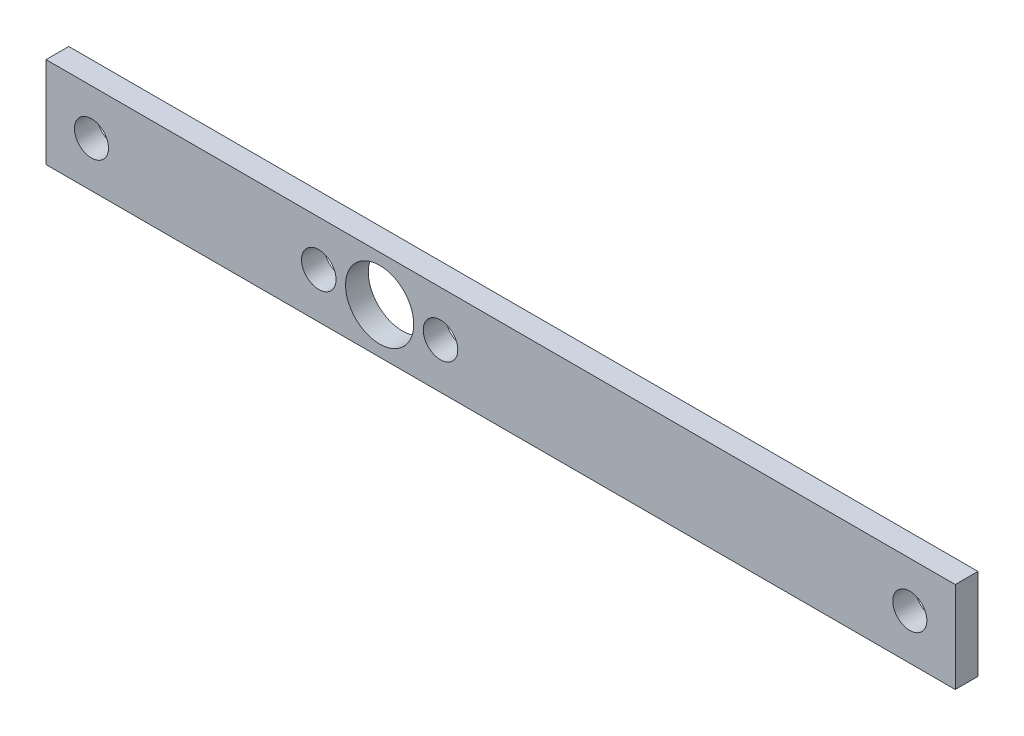
ISO-10303-21;
HEADER;
FILE_DESCRIPTION(('STEP AP214'),'2;1');
FILE_NAME('part.step','',(''),(''),'','','');
FILE_SCHEMA(('AUTOMOTIVE_DESIGN { 1 0 10303 214 1 1 1 1 }'));
ENDSEC;
DATA;
#1=APPLICATION_CONTEXT('core data for automotive mechanical design processes');
#2=APPLICATION_PROTOCOL_DEFINITION('international standard','automotive_design',2000,#1);
#3=PRODUCT_CONTEXT('',#1,'mechanical');
#4=PRODUCT('Part','Part','',(#3));
#5=PRODUCT_RELATED_PRODUCT_CATEGORY('part','',(#4));
#6=PRODUCT_DEFINITION_FORMATION('','',#4);
#7=PRODUCT_DEFINITION_CONTEXT('part definition',#1,'design');
#8=PRODUCT_DEFINITION('design','',#6,#7);
#9=PRODUCT_DEFINITION_SHAPE('','',#8);
#10=(LENGTH_UNIT() NAMED_UNIT(*) SI_UNIT(.MILLI.,.METRE.));
#11=(NAMED_UNIT(*) PLANE_ANGLE_UNIT() SI_UNIT($,.RADIAN.));
#12=(NAMED_UNIT(*) SI_UNIT($,.STERADIAN.) SOLID_ANGLE_UNIT());
#13=UNCERTAINTY_MEASURE_WITH_UNIT(LENGTH_MEASURE(1.E-05),#10,'distance_accuracy_value','');
#14=(GEOMETRIC_REPRESENTATION_CONTEXT(3) GLOBAL_UNCERTAINTY_ASSIGNED_CONTEXT((#13)) GLOBAL_UNIT_ASSIGNED_CONTEXT((#10,
#11,#12)) REPRESENTATION_CONTEXT('',''));
#15=CARTESIAN_POINT('',(0.,0.,0.));
#16=DIRECTION('',(0.,0.,1.));
#17=DIRECTION('',(1.,0.,0.));
#18=AXIS2_PLACEMENT_3D('',#15,#16,#17);
#19=CARTESIAN_POINT('',(0.,0.,3.175));
#20=DIRECTION('',(0.,0.,-1.));
#21=DIRECTION('',(-1.,0.,0.));
#22=AXIS2_PLACEMENT_3D('',#19,#20,#21);
#23=PLANE('',#22);
#24=DIRECTION('',(0.,-1.,0.));
#25=VECTOR('',#24,1.);
#26=CARTESIAN_POINT('',(0.,0.,3.175));
#27=LINE('',#26,#25);
#28=CARTESIAN_POINT('',(0.,12.7,3.175));
#29=VERTEX_POINT('',#28);
#30=CARTESIAN_POINT('',(0.,0.,3.175));
#31=VERTEX_POINT('',#30);
#32=EDGE_CURVE('E89',#29,#31,#27,.T.);
#33=ORIENTED_EDGE('',*,*,#32,.T.);
#34=DIRECTION('',(1.,0.,0.));
#35=VECTOR('',#34,1.);
#36=CARTESIAN_POINT('',(0.,0.,3.175));
#37=LINE('',#36,#35);
#38=CARTESIAN_POINT('',(127.,0.,3.175));
#39=VERTEX_POINT('',#38);
#40=EDGE_CURVE('E84',#31,#39,#37,.T.);
#41=ORIENTED_EDGE('',*,*,#40,.T.);
#42=DIRECTION('',(0.,1.,0.));
#43=VECTOR('',#42,1.);
#44=CARTESIAN_POINT('',(127.,0.,3.175));
#45=LINE('',#44,#43);
#46=CARTESIAN_POINT('',(127.,12.7,3.175));
#47=VERTEX_POINT('',#46);
#48=EDGE_CURVE('E87',#39,#47,#45,.T.);
#49=ORIENTED_EDGE('',*,*,#48,.T.);
#50=DIRECTION('',(-1.,0.,0.));
#51=VECTOR('',#50,1.);
#52=CARTESIAN_POINT('',(0.,12.7,3.175));
#53=LINE('',#52,#51);
#54=EDGE_CURVE('E54',#47,#29,#53,.T.);
#55=ORIENTED_EDGE('',*,*,#54,.T.);
#56=EDGE_LOOP('',(#33,#41,#49,#55));
#57=FACE_BOUND('',#56,.T.);
#58=CARTESIAN_POINT('',(38.1,6.35,3.175));
#59=DIRECTION('',(0.,0.,1.));
#60=DIRECTION('',(1.,0.,0.));
#61=AXIS2_PLACEMENT_3D('',#58,#59,#60);
#62=CIRCLE('',#61,2.413);
#63=CARTESIAN_POINT('',(40.513,6.35,3.175));
#64=VERTEX_POINT('',#63);
#65=EDGE_CURVE('E104',#64,#64,#62,.T.);
#66=ORIENTED_EDGE('',*,*,#65,.F.);
#67=EDGE_LOOP('',(#66));
#68=FACE_BOUND('',#67,.T.);
#69=CARTESIAN_POINT('',(55.1000168,6.35,3.175));
#70=DIRECTION('',(0.,0.,1.));
#71=DIRECTION('',(1.,0.,0.));
#72=AXIS2_PLACEMENT_3D('',#69,#70,#71);
#73=CIRCLE('',#72,2.413);
#74=CARTESIAN_POINT('',(57.5130168,6.35,3.175));
#75=VERTEX_POINT('',#74);
#76=EDGE_CURVE('E119',#75,#75,#73,.T.);
#77=ORIENTED_EDGE('',*,*,#76,.F.);
#78=EDGE_LOOP('',(#77));
#79=FACE_BOUND('',#78,.T.);
#80=CARTESIAN_POINT('',(6.35,6.35,3.175));
#81=DIRECTION('',(0.,0.,1.));
#82=DIRECTION('',(1.,0.,0.));
#83=AXIS2_PLACEMENT_3D('',#80,#81,#82);
#84=CIRCLE('',#83,2.38125);
#85=CARTESIAN_POINT('',(8.73125,6.35,3.175));
#86=VERTEX_POINT('',#85);
#87=EDGE_CURVE('E125',#86,#86,#84,.T.);
#88=ORIENTED_EDGE('',*,*,#87,.F.);
#89=EDGE_LOOP('',(#88));
#90=FACE_BOUND('',#89,.T.);
#91=CARTESIAN_POINT('',(120.65,6.35,3.175));
#92=DIRECTION('',(0.,0.,1.));
#93=DIRECTION('',(1.,0.,0.));
#94=AXIS2_PLACEMENT_3D('',#91,#92,#93);
#95=CIRCLE('',#94,2.38125000000001);
#96=CARTESIAN_POINT('',(123.03125,6.35,3.175));
#97=VERTEX_POINT('',#96);
#98=EDGE_CURVE('E131',#97,#97,#95,.T.);
#99=ORIENTED_EDGE('',*,*,#98,.F.);
#100=EDGE_LOOP('',(#99));
#101=FACE_BOUND('',#100,.T.);
#102=CARTESIAN_POINT('',(46.6000084,6.35,3.175));
#103=DIRECTION('',(0.,0.,1.));
#104=DIRECTION('',(1.,0.,0.));
#105=AXIS2_PLACEMENT_3D('',#102,#103,#104);
#106=CIRCLE('',#105,4.7625);
#107=CARTESIAN_POINT('',(51.3625084,6.35,3.175));
#108=VERTEX_POINT('',#107);
#109=EDGE_CURVE('E137',#108,#108,#106,.T.);
#110=ORIENTED_EDGE('',*,*,#109,.F.);
#111=EDGE_LOOP('',(#110));
#112=FACE_BOUND('',#111,.T.);
#113=ADVANCED_FACE('F37',(#57,#68,#79,#90,#101,#112),#23,.F.);
#114=CARTESIAN_POINT('',(0.,0.,0.));
#115=DIRECTION('',(0.,0.,-1.));
#116=DIRECTION('',(-1.,0.,0.));
#117=AXIS2_PLACEMENT_3D('',#114,#115,#116);
#118=PLANE('',#117);
#119=CARTESIAN_POINT('',(120.65,6.35,0.));
#120=DIRECTION('',(0.,0.,1.));
#121=DIRECTION('',(1.,0.,0.));
#122=AXIS2_PLACEMENT_3D('',#119,#120,#121);
#123=CIRCLE('',#122,2.38125000000001);
#124=CARTESIAN_POINT('',(123.03125,6.35,0.));
#125=VERTEX_POINT('',#124);
#126=EDGE_CURVE('E134',#125,#125,#123,.T.);
#127=ORIENTED_EDGE('',*,*,#126,.T.);
#128=EDGE_LOOP('',(#127));
#129=FACE_BOUND('',#128,.T.);
#130=CARTESIAN_POINT('',(55.1000168,6.35,0.));
#131=DIRECTION('',(0.,0.,1.));
#132=DIRECTION('',(1.,0.,0.));
#133=AXIS2_PLACEMENT_3D('',#130,#131,#132);
#134=CIRCLE('',#133,2.413);
#135=CARTESIAN_POINT('',(57.5130168,6.35,0.));
#136=VERTEX_POINT('',#135);
#137=EDGE_CURVE('E122',#136,#136,#134,.T.);
#138=ORIENTED_EDGE('',*,*,#137,.T.);
#139=EDGE_LOOP('',(#138));
#140=FACE_BOUND('',#139,.T.);
#141=DIRECTION('',(0.,-1.,0.));
#142=VECTOR('',#141,1.);
#143=CARTESIAN_POINT('',(0.,0.,0.));
#144=LINE('',#143,#142);
#145=CARTESIAN_POINT('',(0.,12.7,0.));
#146=VERTEX_POINT('',#145);
#147=CARTESIAN_POINT('',(0.,0.,0.));
#148=VERTEX_POINT('',#147);
#149=EDGE_CURVE('E101',#146,#148,#144,.T.);
#150=ORIENTED_EDGE('',*,*,#149,.F.);
#151=DIRECTION('',(-1.,0.,0.));
#152=VECTOR('',#151,1.);
#153=CARTESIAN_POINT('',(0.,12.7,0.));
#154=LINE('',#153,#152);
#155=CARTESIAN_POINT('',(127.,12.7,0.));
#156=VERTEX_POINT('',#155);
#157=EDGE_CURVE('E77',#156,#146,#154,.T.);
#158=ORIENTED_EDGE('',*,*,#157,.F.);
#159=DIRECTION('',(0.,1.,0.));
#160=VECTOR('',#159,1.);
#161=CARTESIAN_POINT('',(127.,0.,0.));
#162=LINE('',#161,#160);
#163=CARTESIAN_POINT('',(127.,0.,0.));
#164=VERTEX_POINT('',#163);
#165=EDGE_CURVE('E71',#164,#156,#162,.T.);
#166=ORIENTED_EDGE('',*,*,#165,.F.);
#167=DIRECTION('',(1.,0.,0.));
#168=VECTOR('',#167,1.);
#169=CARTESIAN_POINT('',(0.,0.,0.));
#170=LINE('',#169,#168);
#171=EDGE_CURVE('E93',#148,#164,#170,.T.);
#172=ORIENTED_EDGE('',*,*,#171,.F.);
#173=EDGE_LOOP('',(#150,#158,#166,#172));
#174=FACE_BOUND('',#173,.T.);
#175=CARTESIAN_POINT('',(38.1,6.35,0.));
#176=DIRECTION('',(0.,0.,1.));
#177=DIRECTION('',(1.,0.,0.));
#178=AXIS2_PLACEMENT_3D('',#175,#176,#177);
#179=CIRCLE('',#178,2.413);
#180=CARTESIAN_POINT('',(40.513,6.35,0.));
#181=VERTEX_POINT('',#180);
#182=EDGE_CURVE('E116',#181,#181,#179,.T.);
#183=ORIENTED_EDGE('',*,*,#182,.T.);
#184=EDGE_LOOP('',(#183));
#185=FACE_BOUND('',#184,.T.);
#186=CARTESIAN_POINT('',(6.35,6.35,0.));
#187=DIRECTION('',(0.,0.,1.));
#188=DIRECTION('',(1.,0.,0.));
#189=AXIS2_PLACEMENT_3D('',#186,#187,#188);
#190=CIRCLE('',#189,2.38125);
#191=CARTESIAN_POINT('',(8.73125,6.35,0.));
#192=VERTEX_POINT('',#191);
#193=EDGE_CURVE('E128',#192,#192,#190,.T.);
#194=ORIENTED_EDGE('',*,*,#193,.T.);
#195=EDGE_LOOP('',(#194));
#196=FACE_BOUND('',#195,.T.);
#197=CARTESIAN_POINT('',(46.6000084,6.35,0.));
#198=DIRECTION('',(0.,0.,1.));
#199=DIRECTION('',(1.,0.,0.));
#200=AXIS2_PLACEMENT_3D('',#197,#198,#199);
#201=CIRCLE('',#200,4.7625);
#202=CARTESIAN_POINT('',(51.3625084,6.35,0.));
#203=VERTEX_POINT('',#202);
#204=EDGE_CURVE('E140',#203,#203,#201,.T.);
#205=ORIENTED_EDGE('',*,*,#204,.T.);
#206=EDGE_LOOP('',(#205));
#207=FACE_BOUND('',#206,.T.);
#208=ADVANCED_FACE('F112',(#129,#140,#174,#185,#196,#207),#118,.T.);
#209=CARTESIAN_POINT('',(0.,0.,3.175));
#210=DIRECTION('',(1.,0.,0.));
#211=DIRECTION('',(0.,0.,-1.));
#212=AXIS2_PLACEMENT_3D('',#209,#210,#211);
#213=PLANE('',#212);
#214=ORIENTED_EDGE('',*,*,#149,.T.);
#215=DIRECTION('',(0.,0.,-1.));
#216=VECTOR('',#215,1.);
#217=CARTESIAN_POINT('',(0.,0.,3.175));
#218=LINE('',#217,#216);
#219=EDGE_CURVE('E11',#31,#148,#218,.T.);
#220=ORIENTED_EDGE('',*,*,#219,.F.);
#221=ORIENTED_EDGE('',*,*,#32,.F.);
#222=DIRECTION('',(0.,0.,-1.));
#223=VECTOR('',#222,1.);
#224=CARTESIAN_POINT('',(0.,12.7,3.175));
#225=LINE('',#224,#223);
#226=EDGE_CURVE('E97',#29,#146,#225,.T.);
#227=ORIENTED_EDGE('',*,*,#226,.T.);
#228=EDGE_LOOP('',(#214,#220,#221,#227));
#229=FACE_BOUND('',#228,.T.);
#230=ADVANCED_FACE('F39',(#229),#213,.F.);
#231=CARTESIAN_POINT('',(0.,0.,3.175));
#232=DIRECTION('',(0.,1.,0.));
#233=DIRECTION('',(0.,0.,1.));
#234=AXIS2_PLACEMENT_3D('',#231,#232,#233);
#235=PLANE('',#234);
#236=ORIENTED_EDGE('',*,*,#171,.T.);
#237=DIRECTION('',(0.,0.,-1.));
#238=VECTOR('',#237,1.);
#239=CARTESIAN_POINT('',(127.,0.,3.175));
#240=LINE('',#239,#238);
#241=EDGE_CURVE('E46',#39,#164,#240,.T.);
#242=ORIENTED_EDGE('',*,*,#241,.F.);
#243=ORIENTED_EDGE('',*,*,#40,.F.);
#244=ORIENTED_EDGE('',*,*,#219,.T.);
#245=EDGE_LOOP('',(#236,#242,#243,#244));
#246=FACE_BOUND('',#245,.T.);
#247=ADVANCED_FACE('F92',(#246),#235,.F.);
#248=CARTESIAN_POINT('',(127.,0.,3.175));
#249=DIRECTION('',(-1.,0.,0.));
#250=DIRECTION('',(0.,0.,1.));
#251=AXIS2_PLACEMENT_3D('',#248,#249,#250);
#252=PLANE('',#251);
#253=ORIENTED_EDGE('',*,*,#165,.T.);
#254=DIRECTION('',(0.,0.,-1.));
#255=VECTOR('',#254,1.);
#256=CARTESIAN_POINT('',(127.,12.7,3.175));
#257=LINE('',#256,#255);
#258=EDGE_CURVE('E94',#47,#156,#257,.T.);
#259=ORIENTED_EDGE('',*,*,#258,.F.);
#260=ORIENTED_EDGE('',*,*,#48,.F.);
#261=ORIENTED_EDGE('',*,*,#241,.T.);
#262=EDGE_LOOP('',(#253,#259,#260,#261));
#263=FACE_BOUND('',#262,.T.);
#264=ADVANCED_FACE('F95',(#263),#252,.F.);
#265=CARTESIAN_POINT('',(0.,12.7,3.175));
#266=DIRECTION('',(0.,-1.,0.));
#267=DIRECTION('',(0.,0.,-1.));
#268=AXIS2_PLACEMENT_3D('',#265,#266,#267);
#269=PLANE('',#268);
#270=ORIENTED_EDGE('',*,*,#157,.T.);
#271=ORIENTED_EDGE('',*,*,#226,.F.);
#272=ORIENTED_EDGE('',*,*,#54,.F.);
#273=ORIENTED_EDGE('',*,*,#258,.T.);
#274=EDGE_LOOP('',(#270,#271,#272,#273));
#275=FACE_BOUND('',#274,.T.);
#276=ADVANCED_FACE('F109',(#275),#269,.F.);
#277=CARTESIAN_POINT('',(38.1,6.35,3.175));
#278=DIRECTION('',(0.,0.,-1.));
#279=DIRECTION('',(-1.,0.,0.));
#280=AXIS2_PLACEMENT_3D('',#277,#278,#279);
#281=CYLINDRICAL_SURFACE('',#280,2.413);
#282=ORIENTED_EDGE('',*,*,#65,.T.);
#283=EDGE_LOOP('',(#282));
#284=FACE_BOUND('',#283,.T.);
#285=ORIENTED_EDGE('',*,*,#182,.F.);
#286=EDGE_LOOP('',(#285));
#287=FACE_BOUND('',#286,.T.);
#288=ADVANCED_FACE('F157',(#284,#287),#281,.F.);
#289=CARTESIAN_POINT('',(55.1000168,6.35,3.175));
#290=DIRECTION('',(0.,0.,-1.));
#291=DIRECTION('',(-1.,0.,0.));
#292=AXIS2_PLACEMENT_3D('',#289,#290,#291);
#293=CYLINDRICAL_SURFACE('',#292,2.413);
#294=ORIENTED_EDGE('',*,*,#76,.T.);
#295=EDGE_LOOP('',(#294));
#296=FACE_BOUND('',#295,.T.);
#297=ORIENTED_EDGE('',*,*,#137,.F.);
#298=EDGE_LOOP('',(#297));
#299=FACE_BOUND('',#298,.T.);
#300=ADVANCED_FACE('F203',(#296,#299),#293,.F.);
#301=CARTESIAN_POINT('',(6.35,6.35,3.175));
#302=DIRECTION('',(0.,0.,-1.));
#303=DIRECTION('',(-1.,0.,0.));
#304=AXIS2_PLACEMENT_3D('',#301,#302,#303);
#305=CYLINDRICAL_SURFACE('',#304,2.38125);
#306=ORIENTED_EDGE('',*,*,#87,.T.);
#307=EDGE_LOOP('',(#306));
#308=FACE_BOUND('',#307,.T.);
#309=ORIENTED_EDGE('',*,*,#193,.F.);
#310=EDGE_LOOP('',(#309));
#311=FACE_BOUND('',#310,.T.);
#312=ADVANCED_FACE('F211',(#308,#311),#305,.F.);
#313=CARTESIAN_POINT('',(120.65,6.35,3.175));
#314=DIRECTION('',(0.,0.,-1.));
#315=DIRECTION('',(-1.,0.,0.));
#316=AXIS2_PLACEMENT_3D('',#313,#314,#315);
#317=CYLINDRICAL_SURFACE('',#316,2.38125000000001);
#318=ORIENTED_EDGE('',*,*,#98,.T.);
#319=EDGE_LOOP('',(#318));
#320=FACE_BOUND('',#319,.T.);
#321=ORIENTED_EDGE('',*,*,#126,.F.);
#322=EDGE_LOOP('',(#321));
#323=FACE_BOUND('',#322,.T.);
#324=ADVANCED_FACE('F219',(#320,#323),#317,.F.);
#325=CARTESIAN_POINT('',(46.6000084,6.35,3.175));
#326=DIRECTION('',(0.,0.,-1.));
#327=DIRECTION('',(-1.,0.,0.));
#328=AXIS2_PLACEMENT_3D('',#325,#326,#327);
#329=CYLINDRICAL_SURFACE('',#328,4.7625);
#330=ORIENTED_EDGE('',*,*,#109,.T.);
#331=EDGE_LOOP('',(#330));
#332=FACE_BOUND('',#331,.T.);
#333=ORIENTED_EDGE('',*,*,#204,.F.);
#334=EDGE_LOOP('',(#333));
#335=FACE_BOUND('',#334,.T.);
#336=ADVANCED_FACE('F146',(#332,#335),#329,.F.);
#337=CLOSED_SHELL('',(#113,#208,#230,#247,#264,#276,#288,#300,#312,#324,#336));
#338=MANIFOLD_SOLID_BREP('B2',#337);
#339=ADVANCED_BREP_SHAPE_REPRESENTATION('',(#18,#338),#14);
#340=SHAPE_DEFINITION_REPRESENTATION(#9,#339);
ENDSEC;
END-ISO-10303-21;
